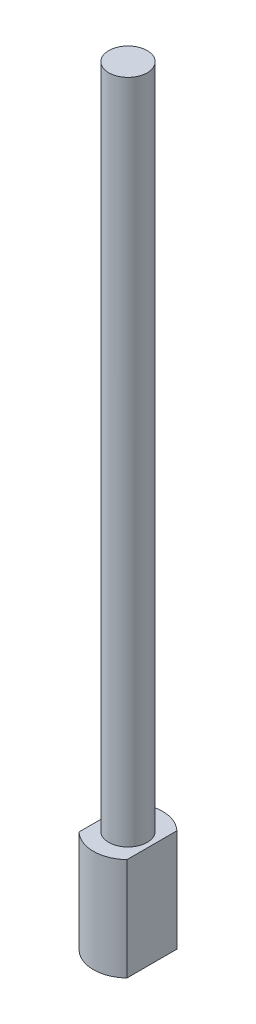
ISO-10303-21;
HEADER;
FILE_DESCRIPTION(('STEP AP214'),'2;1');
FILE_NAME('part.step','',(''),(''),'','','');
FILE_SCHEMA(('AUTOMOTIVE_DESIGN { 1 0 10303 214 1 1 1 1 }'));
ENDSEC;
DATA;
#1=APPLICATION_CONTEXT('core data for automotive mechanical design processes');
#2=APPLICATION_PROTOCOL_DEFINITION('international standard','automotive_design',2000,#1);
#3=PRODUCT_CONTEXT('',#1,'mechanical');
#4=PRODUCT('Part','Part','',(#3));
#5=PRODUCT_RELATED_PRODUCT_CATEGORY('part','',(#4));
#6=PRODUCT_DEFINITION_FORMATION('','',#4);
#7=PRODUCT_DEFINITION_CONTEXT('part definition',#1,'design');
#8=PRODUCT_DEFINITION('design','',#6,#7);
#9=PRODUCT_DEFINITION_SHAPE('','',#8);
#10=(LENGTH_UNIT() NAMED_UNIT(*) SI_UNIT(.MILLI.,.METRE.));
#11=(NAMED_UNIT(*) PLANE_ANGLE_UNIT() SI_UNIT($,.RADIAN.));
#12=(NAMED_UNIT(*) SI_UNIT($,.STERADIAN.) SOLID_ANGLE_UNIT());
#13=UNCERTAINTY_MEASURE_WITH_UNIT(LENGTH_MEASURE(1.E-05),#10,'distance_accuracy_value','');
#14=(GEOMETRIC_REPRESENTATION_CONTEXT(3) GLOBAL_UNCERTAINTY_ASSIGNED_CONTEXT((#13)) GLOBAL_UNIT_ASSIGNED_CONTEXT((#10,
#11,#12)) REPRESENTATION_CONTEXT('',''));
#15=CARTESIAN_POINT('',(0.,0.,0.));
#16=DIRECTION('',(0.,0.,1.));
#17=DIRECTION('',(1.,0.,0.));
#18=AXIS2_PLACEMENT_3D('',#15,#16,#17);
#19=CARTESIAN_POINT('',(0.,60.,0.));
#20=DIRECTION('',(0.,-1.,0.));
#21=DIRECTION('',(0.,0.,-1.));
#22=AXIS2_PLACEMENT_3D('',#19,#20,#21);
#23=CYLINDRICAL_SURFACE('',#22,1.5);
#24=CARTESIAN_POINT('',(0.,60.,0.));
#25=DIRECTION('',(0.,1.,0.));
#26=DIRECTION('',(0.,0.,1.));
#27=AXIS2_PLACEMENT_3D('',#24,#25,#26);
#28=CIRCLE('',#27,1.5);
#29=CARTESIAN_POINT('',(0.,60.,1.5));
#30=VERTEX_POINT('',#29);
#31=EDGE_CURVE('E41',#30,#30,#28,.T.);
#32=ORIENTED_EDGE('',*,*,#31,.F.);
#33=EDGE_LOOP('',(#32));
#34=FACE_BOUND('',#33,.T.);
#35=CARTESIAN_POINT('',(0.,8.,0.));
#36=DIRECTION('',(0.,-1.,0.));
#37=DIRECTION('',(0.,0.,-1.));
#38=AXIS2_PLACEMENT_3D('',#35,#36,#37);
#39=CIRCLE('',#38,1.5);
#40=CARTESIAN_POINT('',(0.,8.,-1.5));
#41=VERTEX_POINT('',#40);
#42=EDGE_CURVE('E11',#41,#41,#39,.T.);
#43=ORIENTED_EDGE('',*,*,#42,.F.);
#44=EDGE_LOOP('',(#43));
#45=FACE_BOUND('',#44,.T.);
#46=ADVANCED_FACE('F33',(#34,#45),#23,.T.);
#47=CARTESIAN_POINT('',(0.,60.,0.));
#48=DIRECTION('',(0.,1.,0.));
#49=DIRECTION('',(0.,0.,1.));
#50=AXIS2_PLACEMENT_3D('',#47,#48,#49);
#51=PLANE('',#50);
#52=ORIENTED_EDGE('',*,*,#31,.T.);
#53=EDGE_LOOP('',(#52));
#54=FACE_BOUND('',#53,.T.);
#55=ADVANCED_FACE('F113',(#54),#51,.T.);
#56=CARTESIAN_POINT('',(0.,8.,0.));
#57=DIRECTION('',(0.,-1.,0.));
#58=DIRECTION('',(0.,0.,-1.));
#59=AXIS2_PLACEMENT_3D('',#56,#57,#58);
#60=CYLINDRICAL_SURFACE('',#59,2.7);
#61=CARTESIAN_POINT('',(0.,0.,0.));
#62=DIRECTION('',(0.,-1.,0.));
#63=DIRECTION('',(0.,0.,-1.));
#64=AXIS2_PLACEMENT_3D('',#61,#62,#63);
#65=CIRCLE('',#64,2.7);
#66=CARTESIAN_POINT('',(-1.87,0.,-1.94758825217241));
#67=VERTEX_POINT('',#66);
#68=CARTESIAN_POINT('',(1.87,0.,-1.94758825217241));
#69=VERTEX_POINT('',#68);
#70=EDGE_CURVE('E100',#67,#69,#65,.T.);
#71=ORIENTED_EDGE('',*,*,#70,.F.);
#72=DIRECTION('',(0.,-1.,0.));
#73=VECTOR('',#72,1.);
#74=CARTESIAN_POINT('',(-1.87,8.,-1.94758825217241));
#75=LINE('',#74,#73);
#76=CARTESIAN_POINT('',(-1.87,8.,-1.94758825217241));
#77=VERTEX_POINT('',#76);
#78=EDGE_CURVE('E49',#77,#67,#75,.T.);
#79=ORIENTED_EDGE('',*,*,#78,.F.);
#80=CARTESIAN_POINT('',(0.,8.,0.));
#81=DIRECTION('',(0.,-1.,0.));
#82=DIRECTION('',(0.,0.,-1.));
#83=AXIS2_PLACEMENT_3D('',#80,#81,#82);
#84=CIRCLE('',#83,2.7);
#85=CARTESIAN_POINT('',(1.87,8.,-1.94758825217241));
#86=VERTEX_POINT('',#85);
#87=EDGE_CURVE('E94',#77,#86,#84,.T.);
#88=ORIENTED_EDGE('',*,*,#87,.T.);
#89=DIRECTION('',(0.,-1.,0.));
#90=VECTOR('',#89,1.);
#91=CARTESIAN_POINT('',(1.87,8.,-1.94758825217241));
#92=LINE('',#91,#90);
#93=EDGE_CURVE('E77',#86,#69,#92,.T.);
#94=ORIENTED_EDGE('',*,*,#93,.T.);
#95=EDGE_LOOP('',(#71,#79,#88,#94));
#96=FACE_BOUND('',#95,.T.);
#97=ADVANCED_FACE('F132',(#96),#60,.T.);
#98=CARTESIAN_POINT('',(-1.87,8.,-1.94758825217241));
#99=DIRECTION('',(-1.,0.,0.));
#100=DIRECTION('',(0.,0.,1.));
#101=AXIS2_PLACEMENT_3D('',#98,#99,#100);
#102=PLANE('',#101);
#103=DIRECTION('',(0.,0.,-1.));
#104=VECTOR('',#103,1.);
#105=CARTESIAN_POINT('',(-1.87,0.,-1.94758825217241));
#106=LINE('',#105,#104);
#107=CARTESIAN_POINT('',(-1.87,0.,1.94758825217242));
#108=VERTEX_POINT('',#107);
#109=EDGE_CURVE('E96',#108,#67,#106,.T.);
#110=ORIENTED_EDGE('',*,*,#109,.F.);
#111=DIRECTION('',(0.,-1.,0.));
#112=VECTOR('',#111,1.);
#113=CARTESIAN_POINT('',(-1.87,8.,1.94758825217242));
#114=LINE('',#113,#112);
#115=CARTESIAN_POINT('',(-1.87,8.,1.94758825217242));
#116=VERTEX_POINT('',#115);
#117=EDGE_CURVE('E66',#116,#108,#114,.T.);
#118=ORIENTED_EDGE('',*,*,#117,.F.);
#119=DIRECTION('',(0.,0.,-1.));
#120=VECTOR('',#119,1.);
#121=CARTESIAN_POINT('',(-1.87,8.,-1.94758825217241));
#122=LINE('',#121,#120);
#123=EDGE_CURVE('E91',#116,#77,#122,.T.);
#124=ORIENTED_EDGE('',*,*,#123,.T.);
#125=ORIENTED_EDGE('',*,*,#78,.T.);
#126=EDGE_LOOP('',(#110,#118,#124,#125));
#127=FACE_BOUND('',#126,.T.);
#128=ADVANCED_FACE('F129',(#127),#102,.T.);
#129=CARTESIAN_POINT('',(0.,8.,0.));
#130=DIRECTION('',(0.,-1.,0.));
#131=DIRECTION('',(0.,0.,-1.));
#132=AXIS2_PLACEMENT_3D('',#129,#130,#131);
#133=CYLINDRICAL_SURFACE('',#132,2.7);
#134=CARTESIAN_POINT('',(0.,0.,0.));
#135=DIRECTION('',(0.,-1.,0.));
#136=DIRECTION('',(0.,0.,-1.));
#137=AXIS2_PLACEMENT_3D('',#134,#135,#136);
#138=CIRCLE('',#137,2.7);
#139=CARTESIAN_POINT('',(1.87,0.,1.94758825217241));
#140=VERTEX_POINT('',#139);
#141=EDGE_CURVE('E85',#140,#108,#138,.T.);
#142=ORIENTED_EDGE('',*,*,#141,.F.);
#143=DIRECTION('',(0.,-1.,0.));
#144=VECTOR('',#143,1.);
#145=CARTESIAN_POINT('',(1.87,8.,1.94758825217241));
#146=LINE('',#145,#144);
#147=CARTESIAN_POINT('',(1.87,8.,1.94758825217241));
#148=VERTEX_POINT('',#147);
#149=EDGE_CURVE('E80',#148,#140,#146,.T.);
#150=ORIENTED_EDGE('',*,*,#149,.F.);
#151=CARTESIAN_POINT('',(0.,8.,0.));
#152=DIRECTION('',(0.,-1.,0.));
#153=DIRECTION('',(0.,0.,-1.));
#154=AXIS2_PLACEMENT_3D('',#151,#152,#153);
#155=CIRCLE('',#154,2.7);
#156=EDGE_CURVE('E83',#148,#116,#155,.T.);
#157=ORIENTED_EDGE('',*,*,#156,.T.);
#158=ORIENTED_EDGE('',*,*,#117,.T.);
#159=EDGE_LOOP('',(#142,#150,#157,#158));
#160=FACE_BOUND('',#159,.T.);
#161=ADVANCED_FACE('F82',(#160),#133,.T.);
#162=CARTESIAN_POINT('',(1.87,8.,-1.94758825217241));
#163=DIRECTION('',(1.,0.,0.));
#164=DIRECTION('',(0.,0.,-1.));
#165=AXIS2_PLACEMENT_3D('',#162,#163,#164);
#166=PLANE('',#165);
#167=DIRECTION('',(0.,0.,1.));
#168=VECTOR('',#167,1.);
#169=CARTESIAN_POINT('',(1.87,0.,-1.94758825217241));
#170=LINE('',#169,#168);
#171=EDGE_CURVE('E103',#69,#140,#170,.T.);
#172=ORIENTED_EDGE('',*,*,#171,.F.);
#173=ORIENTED_EDGE('',*,*,#93,.F.);
#174=DIRECTION('',(0.,0.,1.));
#175=VECTOR('',#174,1.);
#176=CARTESIAN_POINT('',(1.87,8.,-1.94758825217241));
#177=LINE('',#176,#175);
#178=EDGE_CURVE('E90',#86,#148,#177,.T.);
#179=ORIENTED_EDGE('',*,*,#178,.T.);
#180=ORIENTED_EDGE('',*,*,#149,.T.);
#181=EDGE_LOOP('',(#172,#173,#179,#180));
#182=FACE_BOUND('',#181,.T.);
#183=ADVANCED_FACE('F93',(#182),#166,.T.);
#184=CARTESIAN_POINT('',(0.,8.,0.));
#185=DIRECTION('',(0.,-1.,0.));
#186=DIRECTION('',(0.,0.,-1.));
#187=AXIS2_PLACEMENT_3D('',#184,#185,#186);
#188=PLANE('',#187);
#189=ORIENTED_EDGE('',*,*,#42,.T.);
#190=EDGE_LOOP('',(#189));
#191=FACE_BOUND('',#190,.T.);
#192=ORIENTED_EDGE('',*,*,#87,.F.);
#193=ORIENTED_EDGE('',*,*,#123,.F.);
#194=ORIENTED_EDGE('',*,*,#156,.F.);
#195=ORIENTED_EDGE('',*,*,#178,.F.);
#196=EDGE_LOOP('',(#192,#193,#194,#195));
#197=FACE_BOUND('',#196,.T.);
#198=ADVANCED_FACE('F89',(#191,#197),#188,.F.);
#199=CARTESIAN_POINT('',(0.,0.,0.));
#200=DIRECTION('',(0.,1.,0.));
#201=DIRECTION('',(0.,0.,1.));
#202=AXIS2_PLACEMENT_3D('',#199,#200,#201);
#203=PLANE('',#202);
#204=ORIENTED_EDGE('',*,*,#70,.T.);
#205=ORIENTED_EDGE('',*,*,#171,.T.);
#206=ORIENTED_EDGE('',*,*,#141,.T.);
#207=ORIENTED_EDGE('',*,*,#109,.T.);
#208=EDGE_LOOP('',(#204,#205,#206,#207));
#209=FACE_BOUND('',#208,.T.);
#210=ADVANCED_FACE('F120',(#209),#203,.F.);
#211=CLOSED_SHELL('',(#46,#55,#97,#128,#161,#183,#198,#210));
#212=MANIFOLD_SOLID_BREP('B2',#211);
#213=ADVANCED_BREP_SHAPE_REPRESENTATION('',(#18,#212),#14);
#214=SHAPE_DEFINITION_REPRESENTATION(#9,#213);
ENDSEC;
END-ISO-10303-21;
